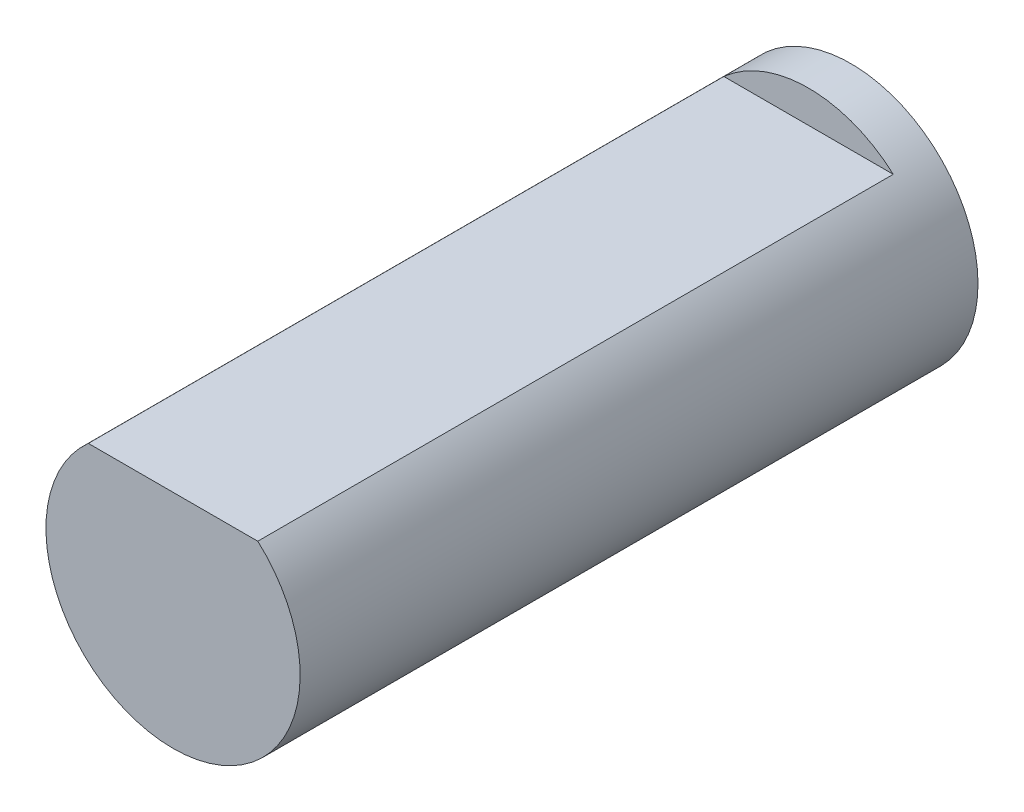
ISO-10303-21;
HEADER;
FILE_DESCRIPTION(('STEP AP214'),'2;1');
FILE_NAME('part.step','',(''),(''),'','','');
FILE_SCHEMA(('AUTOMOTIVE_DESIGN { 1 0 10303 214 1 1 1 1 }'));
ENDSEC;
DATA;
#1=APPLICATION_CONTEXT('core data for automotive mechanical design processes');
#2=APPLICATION_PROTOCOL_DEFINITION('international standard','automotive_design',2000,#1);
#3=PRODUCT_CONTEXT('',#1,'mechanical');
#4=PRODUCT('Part','Part','',(#3));
#5=PRODUCT_RELATED_PRODUCT_CATEGORY('part','',(#4));
#6=PRODUCT_DEFINITION_FORMATION('','',#4);
#7=PRODUCT_DEFINITION_CONTEXT('part definition',#1,'design');
#8=PRODUCT_DEFINITION('design','',#6,#7);
#9=PRODUCT_DEFINITION_SHAPE('','',#8);
#10=(LENGTH_UNIT() NAMED_UNIT(*) SI_UNIT(.MILLI.,.METRE.));
#11=(NAMED_UNIT(*) PLANE_ANGLE_UNIT() SI_UNIT($,.RADIAN.));
#12=(NAMED_UNIT(*) SI_UNIT($,.STERADIAN.) SOLID_ANGLE_UNIT());
#13=UNCERTAINTY_MEASURE_WITH_UNIT(LENGTH_MEASURE(1.E-05),#10,'distance_accuracy_value','');
#14=(GEOMETRIC_REPRESENTATION_CONTEXT(3) GLOBAL_UNCERTAINTY_ASSIGNED_CONTEXT((#13)) GLOBAL_UNIT_ASSIGNED_CONTEXT((#10,
#11,#12)) REPRESENTATION_CONTEXT('',''));
#15=CARTESIAN_POINT('',(0.,0.,0.));
#16=DIRECTION('',(0.,0.,1.));
#17=DIRECTION('',(1.,0.,0.));
#18=AXIS2_PLACEMENT_3D('',#15,#16,#17);
#19=CARTESIAN_POINT('',(0.,0.,0.5));
#20=DIRECTION('',(0.,0.,-1.));
#21=DIRECTION('',(-1.,0.,0.));
#22=AXIS2_PLACEMENT_3D('',#19,#20,#21);
#23=CYLINDRICAL_SURFACE('',#22,1.5);
#24=CARTESIAN_POINT('',(0.,0.,0.5));
#25=DIRECTION('',(0.,0.,1.));
#26=DIRECTION('',(1.,0.,0.));
#27=AXIS2_PLACEMENT_3D('',#24,#25,#26);
#28=CIRCLE('',#27,1.5);
#29=CARTESIAN_POINT('',(1.,1.1180339887499,0.5));
#30=VERTEX_POINT('',#29);
#31=CARTESIAN_POINT('',(-1.,1.1180339887499,0.5));
#32=VERTEX_POINT('',#31);
#33=EDGE_CURVE('E11',#30,#32,#28,.T.);
#34=ORIENTED_EDGE('',*,*,#33,.F.);
#35=DIRECTION('',(0.,0.,-1.));
#36=VECTOR('',#35,1.);
#37=CARTESIAN_POINT('',(1.,1.1180339887499,8.));
#38=LINE('',#37,#36);
#39=CARTESIAN_POINT('',(1.,1.1180339887499,8.));
#40=VERTEX_POINT('',#39);
#41=EDGE_CURVE('E74',#40,#30,#38,.T.);
#42=ORIENTED_EDGE('',*,*,#41,.F.);
#43=CARTESIAN_POINT('',(0.,0.,8.));
#44=DIRECTION('',(0.,0.,1.));
#45=DIRECTION('',(1.,0.,0.));
#46=AXIS2_PLACEMENT_3D('',#43,#44,#45);
#47=CIRCLE('',#46,1.5);
#48=CARTESIAN_POINT('',(-1.,1.1180339887499,8.));
#49=VERTEX_POINT('',#48);
#50=EDGE_CURVE('E73',#49,#40,#47,.T.);
#51=ORIENTED_EDGE('',*,*,#50,.F.);
#52=DIRECTION('',(0.,0.,-1.));
#53=VECTOR('',#52,1.);
#54=CARTESIAN_POINT('',(-1.,1.1180339887499,8.));
#55=LINE('',#54,#53);
#56=EDGE_CURVE('E75',#49,#32,#55,.T.);
#57=ORIENTED_EDGE('',*,*,#56,.T.);
#58=EDGE_LOOP('',(#34,#42,#51,#57));
#59=FACE_BOUND('',#58,.T.);
#60=CARTESIAN_POINT('',(0.,0.,0.));
#61=DIRECTION('',(0.,0.,1.));
#62=DIRECTION('',(1.,0.,0.));
#63=AXIS2_PLACEMENT_3D('',#60,#61,#62);
#64=CIRCLE('',#63,1.5);
#65=CARTESIAN_POINT('',(1.5,0.,0.));
#66=VERTEX_POINT('',#65);
#67=EDGE_CURVE('E42',#66,#66,#64,.T.);
#68=ORIENTED_EDGE('',*,*,#67,.T.);
#69=EDGE_LOOP('',(#68));
#70=FACE_BOUND('',#69,.T.);
#71=ADVANCED_FACE('F41',(#59,#70),#23,.T.);
#72=CARTESIAN_POINT('',(0.,0.,0.5));
#73=DIRECTION('',(0.,0.,1.));
#74=DIRECTION('',(1.,0.,0.));
#75=AXIS2_PLACEMENT_3D('',#72,#73,#74);
#76=PLANE('',#75);
#77=DIRECTION('',(-1.,0.,0.));
#78=VECTOR('',#77,1.);
#79=CARTESIAN_POINT('',(-1.,1.1180339887499,0.5));
#80=LINE('',#79,#78);
#81=EDGE_CURVE('E52',#30,#32,#80,.T.);
#82=ORIENTED_EDGE('',*,*,#81,.F.);
#83=ORIENTED_EDGE('',*,*,#33,.T.);
#84=EDGE_LOOP('',(#82,#83));
#85=FACE_BOUND('',#84,.T.);
#86=ADVANCED_FACE('F61',(#85),#76,.T.);
#87=CARTESIAN_POINT('',(0.,0.,0.));
#88=DIRECTION('',(0.,0.,1.));
#89=DIRECTION('',(1.,0.,0.));
#90=AXIS2_PLACEMENT_3D('',#87,#88,#89);
#91=PLANE('',#90);
#92=ORIENTED_EDGE('',*,*,#67,.F.);
#93=EDGE_LOOP('',(#92));
#94=FACE_BOUND('',#93,.T.);
#95=ADVANCED_FACE('F86',(#94),#91,.F.);
#96=CARTESIAN_POINT('',(-1.,1.1180339887499,8.));
#97=DIRECTION('',(0.,-1.,0.));
#98=DIRECTION('',(0.,0.,-1.));
#99=AXIS2_PLACEMENT_3D('',#96,#97,#98);
#100=PLANE('',#99);
#101=ORIENTED_EDGE('',*,*,#81,.T.);
#102=ORIENTED_EDGE('',*,*,#56,.F.);
#103=DIRECTION('',(-1.,0.,0.));
#104=VECTOR('',#103,1.);
#105=CARTESIAN_POINT('',(-1.,1.1180339887499,8.));
#106=LINE('',#105,#104);
#107=EDGE_CURVE('E63',#40,#49,#106,.T.);
#108=ORIENTED_EDGE('',*,*,#107,.F.);
#109=ORIENTED_EDGE('',*,*,#41,.T.);
#110=EDGE_LOOP('',(#101,#102,#108,#109));
#111=FACE_BOUND('',#110,.T.);
#112=ADVANCED_FACE('F72',(#111),#100,.F.);
#113=CARTESIAN_POINT('',(0.,0.,8.));
#114=DIRECTION('',(0.,0.,1.));
#115=DIRECTION('',(1.,0.,0.));
#116=AXIS2_PLACEMENT_3D('',#113,#114,#115);
#117=PLANE('',#116);
#118=ORIENTED_EDGE('',*,*,#50,.T.);
#119=ORIENTED_EDGE('',*,*,#107,.T.);
#120=EDGE_LOOP('',(#118,#119));
#121=FACE_BOUND('',#120,.T.);
#122=ADVANCED_FACE('F85',(#121),#117,.T.);
#123=CLOSED_SHELL('',(#71,#86,#95,#112,#122));
#124=MANIFOLD_SOLID_BREP('B2',#123);
#125=ADVANCED_BREP_SHAPE_REPRESENTATION('',(#18,#124),#14);
#126=SHAPE_DEFINITION_REPRESENTATION(#9,#125);
ENDSEC;
END-ISO-10303-21;
